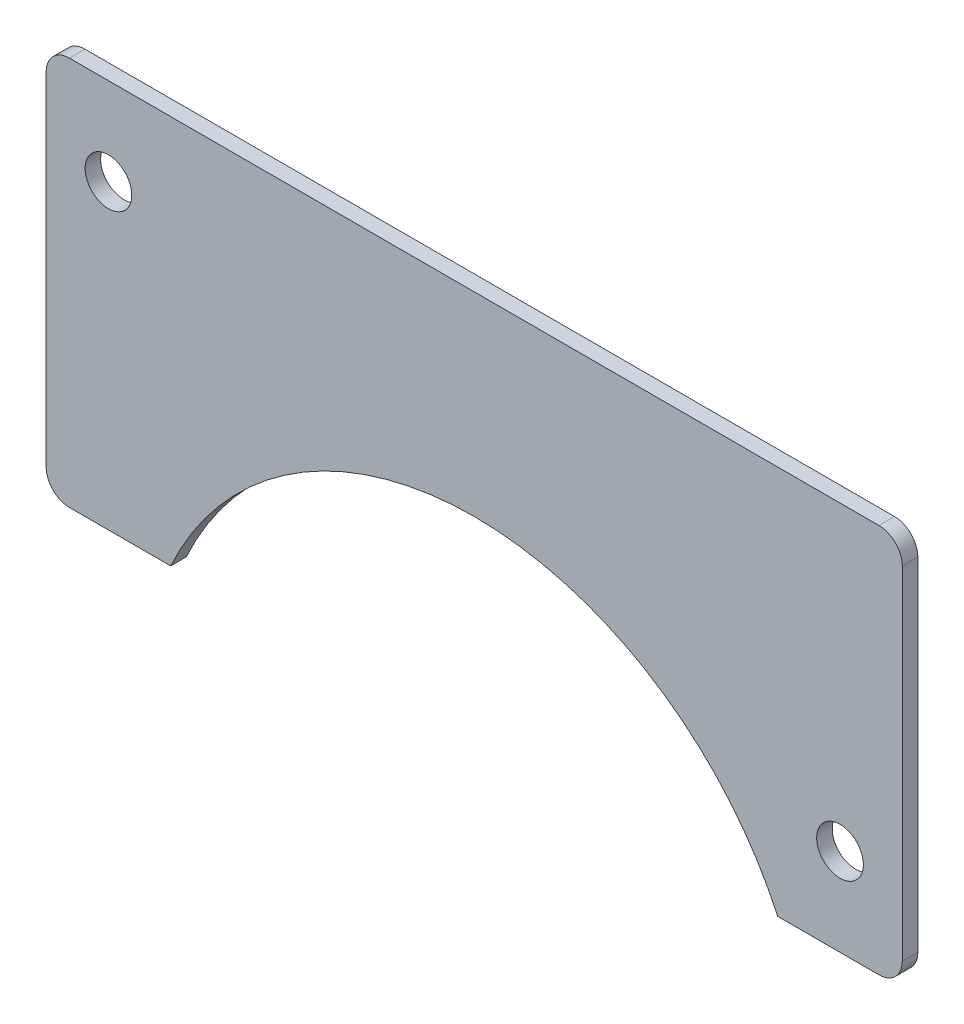
ISO-10303-21;
HEADER;
FILE_DESCRIPTION(('STEP AP214'),'2;1');
FILE_NAME('part.step','',(''),(''),'','','');
FILE_SCHEMA(('AUTOMOTIVE_DESIGN { 1 0 10303 214 1 1 1 1 }'));
ENDSEC;
DATA;
#1=APPLICATION_CONTEXT('core data for automotive mechanical design processes');
#2=APPLICATION_PROTOCOL_DEFINITION('international standard','automotive_design',2000,#1);
#3=PRODUCT_CONTEXT('',#1,'mechanical');
#4=PRODUCT('Part','Part','',(#3));
#5=PRODUCT_RELATED_PRODUCT_CATEGORY('part','',(#4));
#6=PRODUCT_DEFINITION_FORMATION('','',#4);
#7=PRODUCT_DEFINITION_CONTEXT('part definition',#1,'design');
#8=PRODUCT_DEFINITION('design','',#6,#7);
#9=PRODUCT_DEFINITION_SHAPE('','',#8);
#10=(LENGTH_UNIT() NAMED_UNIT(*) SI_UNIT(.MILLI.,.METRE.));
#11=(NAMED_UNIT(*) PLANE_ANGLE_UNIT() SI_UNIT($,.RADIAN.));
#12=(NAMED_UNIT(*) SI_UNIT($,.STERADIAN.) SOLID_ANGLE_UNIT());
#13=UNCERTAINTY_MEASURE_WITH_UNIT(LENGTH_MEASURE(1.E-05),#10,'distance_accuracy_value','');
#14=(GEOMETRIC_REPRESENTATION_CONTEXT(3) GLOBAL_UNCERTAINTY_ASSIGNED_CONTEXT((#13)) GLOBAL_UNIT_ASSIGNED_CONTEXT((#10,
#11,#12)) REPRESENTATION_CONTEXT('',''));
#15=CARTESIAN_POINT('',(0.,0.,0.));
#16=DIRECTION('',(0.,0.,1.));
#17=DIRECTION('',(1.,0.,0.));
#18=AXIS2_PLACEMENT_3D('',#15,#16,#17);
#19=CARTESIAN_POINT('',(-30.0000000000002,0.,20.));
#20=DIRECTION('',(0.,1.,0.));
#21=DIRECTION('',(-1.,0.,0.));
#22=AXIS2_PLACEMENT_3D('',#19,#20,#21);
#23=PLANE('',#22);
#24=DIRECTION('',(1.,0.,0.));
#25=VECTOR('',#24,1.);
#26=CARTESIAN_POINT('',(-30.0000000000002,0.,20.));
#27=LINE('',#26,#25);
#28=CARTESIAN_POINT('',(-160.,0.,20.));
#29=VERTEX_POINT('',#28);
#30=CARTESIAN_POINT('',(-30.0000000000002,0.,20.));
#31=VERTEX_POINT('',#30);
#32=EDGE_CURVE('E199',#29,#31,#27,.T.);
#33=ORIENTED_EDGE('',*,*,#32,.F.);
#34=DIRECTION('',(0.,0.,-1.));
#35=VECTOR('',#34,1.);
#36=CARTESIAN_POINT('',(-160.,0.,20.));
#37=LINE('',#36,#35);
#38=CARTESIAN_POINT('',(-160.,0.,0.));
#39=VERTEX_POINT('',#38);
#40=EDGE_CURVE('E194',#29,#39,#37,.T.);
#41=ORIENTED_EDGE('',*,*,#40,.T.);
#42=DIRECTION('',(1.,0.,0.));
#43=VECTOR('',#42,1.);
#44=CARTESIAN_POINT('',(-30.0000000000002,0.,0.));
#45=LINE('',#44,#43);
#46=CARTESIAN_POINT('',(-30.0000000000002,0.,0.));
#47=VERTEX_POINT('',#46);
#48=EDGE_CURVE('E150',#39,#47,#45,.T.);
#49=ORIENTED_EDGE('',*,*,#48,.T.);
#50=DIRECTION('',(0.,0.,-1.));
#51=VECTOR('',#50,1.);
#52=CARTESIAN_POINT('',(-30.0000000000002,0.,20.));
#53=LINE('',#52,#51);
#54=EDGE_CURVE('E164',#31,#47,#53,.T.);
#55=ORIENTED_EDGE('',*,*,#54,.F.);
#56=EDGE_LOOP('',(#33,#41,#49,#55));
#57=FACE_BOUND('',#56,.T.);
#58=ADVANCED_FACE('F32',(#57),#23,.F.);
#59=CARTESIAN_POINT('',(-1070.,470.,20.));
#60=DIRECTION('',(0.,0.,1.));
#61=DIRECTION('',(1.,0.,0.));
#62=AXIS2_PLACEMENT_3D('',#59,#60,#61);
#63=PLANE('',#62);
#64=CARTESIAN_POINT('',(-550.,-179.2,20.));
#65=DIRECTION('',(0.,0.,-1.));
#66=DIRECTION('',(1.,0.,0.));
#67=AXIS2_PLACEMENT_3D('',#64,#65,#66);
#68=CIRCLE('',#67,429.2);
#69=CARTESIAN_POINT('',(-940.,-1.15116799119851E-13,20.));
#70=VERTEX_POINT('',#69);
#71=EDGE_CURVE('E47',#70,#29,#68,.T.);
#72=ORIENTED_EDGE('',*,*,#71,.T.);
#73=ORIENTED_EDGE('',*,*,#32,.T.);
#74=CARTESIAN_POINT('',(-30.,30.,20.));
#75=DIRECTION('',(0.,0.,1.));
#76=DIRECTION('',(1.,0.,0.));
#77=AXIS2_PLACEMENT_3D('',#74,#75,#76);
#78=CIRCLE('',#77,30.);
#79=CARTESIAN_POINT('',(0.,30.0000000000002,20.));
#80=VERTEX_POINT('',#79);
#81=EDGE_CURVE('E121',#31,#80,#78,.T.);
#82=ORIENTED_EDGE('',*,*,#81,.T.);
#83=DIRECTION('',(0.,1.,0.));
#84=VECTOR('',#83,1.);
#85=CARTESIAN_POINT('',(0.,30.0000000000002,20.));
#86=LINE('',#85,#84);
#87=CARTESIAN_POINT('',(0.,470.,20.));
#88=VERTEX_POINT('',#87);
#89=EDGE_CURVE('E113',#80,#88,#86,.T.);
#90=ORIENTED_EDGE('',*,*,#89,.T.);
#91=CARTESIAN_POINT('',(-30.,470.,20.));
#92=DIRECTION('',(0.,0.,1.));
#93=DIRECTION('',(1.,0.,0.));
#94=AXIS2_PLACEMENT_3D('',#91,#92,#93);
#95=CIRCLE('',#94,30.);
#96=CARTESIAN_POINT('',(-30.0000000000002,500.,20.));
#97=VERTEX_POINT('',#96);
#98=EDGE_CURVE('E118',#88,#97,#95,.T.);
#99=ORIENTED_EDGE('',*,*,#98,.T.);
#100=DIRECTION('',(-1.,0.,0.));
#101=VECTOR('',#100,1.);
#102=CARTESIAN_POINT('',(-30.0000000000002,500.,20.));
#103=LINE('',#102,#101);
#104=CARTESIAN_POINT('',(-1070.,500.,20.));
#105=VERTEX_POINT('',#104);
#106=EDGE_CURVE('E56',#97,#105,#103,.T.);
#107=ORIENTED_EDGE('',*,*,#106,.T.);
#108=CARTESIAN_POINT('',(-1070.,470.,20.));
#109=DIRECTION('',(0.,0.,1.));
#110=DIRECTION('',(1.,0.,0.));
#111=AXIS2_PLACEMENT_3D('',#108,#109,#110);
#112=CIRCLE('',#111,30.);
#113=CARTESIAN_POINT('',(-1100.,470.,20.));
#114=VERTEX_POINT('',#113);
#115=EDGE_CURVE('E160',#105,#114,#112,.T.);
#116=ORIENTED_EDGE('',*,*,#115,.T.);
#117=DIRECTION('',(0.,-1.,0.));
#118=VECTOR('',#117,1.);
#119=CARTESIAN_POINT('',(-1100.,30.0000000000001,20.));
#120=LINE('',#119,#118);
#121=CARTESIAN_POINT('',(-1100.,29.9999999999999,20.));
#122=VERTEX_POINT('',#121);
#123=EDGE_CURVE('E97',#114,#122,#120,.T.);
#124=ORIENTED_EDGE('',*,*,#123,.T.);
#125=CARTESIAN_POINT('',(-1070.,29.9999999999999,20.));
#126=DIRECTION('',(0.,0.,1.));
#127=DIRECTION('',(-1.,0.,0.));
#128=AXIS2_PLACEMENT_3D('',#125,#126,#127);
#129=CIRCLE('',#128,30.);
#130=CARTESIAN_POINT('',(-1070.,-1.31037207508767E-13,20.));
#131=VERTEX_POINT('',#130);
#132=EDGE_CURVE('E175',#122,#131,#129,.T.);
#133=ORIENTED_EDGE('',*,*,#132,.T.);
#134=EDGE_CURVE('E204',#131,#70,#27,.T.);
#135=ORIENTED_EDGE('',*,*,#134,.T.);
#136=EDGE_LOOP('',(#72,#73,#82,#90,#99,#107,#116,#124,#133,#135));
#137=FACE_BOUND('',#136,.T.);
#138=CARTESIAN_POINT('',(-1020.,387.5,20.));
#139=DIRECTION('',(0.,0.,1.));
#140=DIRECTION('',(1.,0.,0.));
#141=AXIS2_PLACEMENT_3D('',#138,#139,#140);
#142=CIRCLE('',#141,30.0000000000001);
#143=CARTESIAN_POINT('',(-990.,387.5,20.));
#144=VERTEX_POINT('',#143);
#145=EDGE_CURVE('E146',#144,#144,#142,.T.);
#146=ORIENTED_EDGE('',*,*,#145,.F.);
#147=EDGE_LOOP('',(#146));
#148=FACE_BOUND('',#147,.T.);
#149=CARTESIAN_POINT('',(-80.,112.5,20.));
#150=DIRECTION('',(0.,0.,1.));
#151=DIRECTION('',(1.,0.,0.));
#152=AXIS2_PLACEMENT_3D('',#149,#150,#151);
#153=CIRCLE('',#152,30.);
#154=CARTESIAN_POINT('',(-50.,112.5,20.));
#155=VERTEX_POINT('',#154);
#156=EDGE_CURVE('E213',#155,#155,#153,.T.);
#157=ORIENTED_EDGE('',*,*,#156,.F.);
#158=EDGE_LOOP('',(#157));
#159=FACE_BOUND('',#158,.T.);
#160=ADVANCED_FACE('F115',(#137,#148,#159),#63,.T.);
#161=CARTESIAN_POINT('',(-1070.,470.,0.));
#162=DIRECTION('',(0.,0.,1.));
#163=DIRECTION('',(1.,0.,0.));
#164=AXIS2_PLACEMENT_3D('',#161,#162,#163);
#165=PLANE('',#164);
#166=ORIENTED_EDGE('',*,*,#48,.F.);
#167=CARTESIAN_POINT('',(-550.,-179.2,0.));
#168=DIRECTION('',(0.,0.,-1.));
#169=DIRECTION('',(1.,0.,0.));
#170=AXIS2_PLACEMENT_3D('',#167,#168,#169);
#171=CIRCLE('',#170,429.2);
#172=CARTESIAN_POINT('',(-940.,0.,0.));
#173=VERTEX_POINT('',#172);
#174=EDGE_CURVE('E184',#173,#39,#171,.T.);
#175=ORIENTED_EDGE('',*,*,#174,.F.);
#176=CARTESIAN_POINT('',(-1070.,-1.31037207508767E-13,0.));
#177=VERTEX_POINT('',#176);
#178=EDGE_CURVE('E151',#177,#173,#45,.T.);
#179=ORIENTED_EDGE('',*,*,#178,.F.);
#180=CARTESIAN_POINT('',(-1070.,29.9999999999999,0.));
#181=DIRECTION('',(0.,0.,1.));
#182=DIRECTION('',(-1.,0.,0.));
#183=AXIS2_PLACEMENT_3D('',#180,#181,#182);
#184=CIRCLE('',#183,30.);
#185=CARTESIAN_POINT('',(-1100.,29.9999999999999,0.));
#186=VERTEX_POINT('',#185);
#187=EDGE_CURVE('E148',#186,#177,#184,.T.);
#188=ORIENTED_EDGE('',*,*,#187,.F.);
#189=DIRECTION('',(0.,-1.,0.));
#190=VECTOR('',#189,1.);
#191=CARTESIAN_POINT('',(-1100.,30.0000000000001,0.));
#192=LINE('',#191,#190);
#193=CARTESIAN_POINT('',(-1100.,470.,0.));
#194=VERTEX_POINT('',#193);
#195=EDGE_CURVE('E145',#194,#186,#192,.T.);
#196=ORIENTED_EDGE('',*,*,#195,.F.);
#197=CARTESIAN_POINT('',(-1070.,470.,0.));
#198=DIRECTION('',(0.,0.,1.));
#199=DIRECTION('',(1.,0.,0.));
#200=AXIS2_PLACEMENT_3D('',#197,#198,#199);
#201=CIRCLE('',#200,30.);
#202=CARTESIAN_POINT('',(-1070.,500.,0.));
#203=VERTEX_POINT('',#202);
#204=EDGE_CURVE('E142',#203,#194,#201,.T.);
#205=ORIENTED_EDGE('',*,*,#204,.F.);
#206=DIRECTION('',(-1.,0.,0.));
#207=VECTOR('',#206,1.);
#208=CARTESIAN_POINT('',(-30.0000000000002,500.,0.));
#209=LINE('',#208,#207);
#210=CARTESIAN_POINT('',(-30.0000000000002,500.,0.));
#211=VERTEX_POINT('',#210);
#212=EDGE_CURVE('E89',#211,#203,#209,.T.);
#213=ORIENTED_EDGE('',*,*,#212,.F.);
#214=CARTESIAN_POINT('',(-30.,470.,0.));
#215=DIRECTION('',(0.,0.,1.));
#216=DIRECTION('',(1.,0.,0.));
#217=AXIS2_PLACEMENT_3D('',#214,#215,#216);
#218=CIRCLE('',#217,30.);
#219=CARTESIAN_POINT('',(0.,470.,0.));
#220=VERTEX_POINT('',#219);
#221=EDGE_CURVE('E157',#220,#211,#218,.T.);
#222=ORIENTED_EDGE('',*,*,#221,.F.);
#223=DIRECTION('',(0.,1.,0.));
#224=VECTOR('',#223,1.);
#225=CARTESIAN_POINT('',(0.,30.0000000000002,0.));
#226=LINE('',#225,#224);
#227=CARTESIAN_POINT('',(0.,30.0000000000002,0.));
#228=VERTEX_POINT('',#227);
#229=EDGE_CURVE('E130',#228,#220,#226,.T.);
#230=ORIENTED_EDGE('',*,*,#229,.F.);
#231=CARTESIAN_POINT('',(-30.,30.,0.));
#232=DIRECTION('',(0.,0.,1.));
#233=DIRECTION('',(1.,0.,0.));
#234=AXIS2_PLACEMENT_3D('',#231,#232,#233);
#235=CIRCLE('',#234,30.);
#236=EDGE_CURVE('E154',#47,#228,#235,.T.);
#237=ORIENTED_EDGE('',*,*,#236,.F.);
#238=EDGE_LOOP('',(#166,#175,#179,#188,#196,#205,#213,#222,#230,#237));
#239=FACE_BOUND('',#238,.T.);
#240=CARTESIAN_POINT('',(-1020.,387.5,0.));
#241=DIRECTION('',(0.,0.,1.));
#242=DIRECTION('',(1.,0.,0.));
#243=AXIS2_PLACEMENT_3D('',#240,#241,#242);
#244=CIRCLE('',#243,30.0000000000001);
#245=CARTESIAN_POINT('',(-990.,387.5,0.));
#246=VERTEX_POINT('',#245);
#247=EDGE_CURVE('E210',#246,#246,#244,.T.);
#248=ORIENTED_EDGE('',*,*,#247,.T.);
#249=EDGE_LOOP('',(#248));
#250=FACE_BOUND('',#249,.T.);
#251=CARTESIAN_POINT('',(-80.,112.5,0.));
#252=DIRECTION('',(0.,0.,1.));
#253=DIRECTION('',(1.,0.,0.));
#254=AXIS2_PLACEMENT_3D('',#251,#252,#253);
#255=CIRCLE('',#254,30.);
#256=CARTESIAN_POINT('',(-50.,112.5,0.));
#257=VERTEX_POINT('',#256);
#258=EDGE_CURVE('E216',#257,#257,#255,.T.);
#259=ORIENTED_EDGE('',*,*,#258,.T.);
#260=EDGE_LOOP('',(#259));
#261=FACE_BOUND('',#260,.T.);
#262=ADVANCED_FACE('F179',(#239,#250,#261),#165,.F.);
#263=CARTESIAN_POINT('',(-1070.,470.,20.));
#264=DIRECTION('',(0.,0.,-1.));
#265=DIRECTION('',(-1.,0.,0.));
#266=AXIS2_PLACEMENT_3D('',#263,#264,#265);
#267=CYLINDRICAL_SURFACE('',#266,30.);
#268=ORIENTED_EDGE('',*,*,#204,.T.);
#269=DIRECTION('',(0.,0.,-1.));
#270=VECTOR('',#269,1.);
#271=CARTESIAN_POINT('',(-1100.,470.,20.));
#272=LINE('',#271,#270);
#273=EDGE_CURVE('E11',#114,#194,#272,.T.);
#274=ORIENTED_EDGE('',*,*,#273,.F.);
#275=ORIENTED_EDGE('',*,*,#115,.F.);
#276=DIRECTION('',(0.,0.,-1.));
#277=VECTOR('',#276,1.);
#278=CARTESIAN_POINT('',(-1070.,500.,20.));
#279=LINE('',#278,#277);
#280=EDGE_CURVE('E138',#105,#203,#279,.T.);
#281=ORIENTED_EDGE('',*,*,#280,.T.);
#282=EDGE_LOOP('',(#268,#274,#275,#281));
#283=FACE_BOUND('',#282,.T.);
#284=ADVANCED_FACE('F34',(#283),#267,.T.);
#285=CARTESIAN_POINT('',(-1100.,30.0000000000001,20.));
#286=DIRECTION('',(1.,0.,0.));
#287=DIRECTION('',(0.,0.,-1.));
#288=AXIS2_PLACEMENT_3D('',#285,#286,#287);
#289=PLANE('',#288);
#290=ORIENTED_EDGE('',*,*,#195,.T.);
#291=DIRECTION('',(0.,0.,-1.));
#292=VECTOR('',#291,1.);
#293=CARTESIAN_POINT('',(-1100.,29.9999999999999,20.));
#294=LINE('',#293,#292);
#295=EDGE_CURVE('E40',#122,#186,#294,.T.);
#296=ORIENTED_EDGE('',*,*,#295,.F.);
#297=ORIENTED_EDGE('',*,*,#123,.F.);
#298=ORIENTED_EDGE('',*,*,#273,.T.);
#299=EDGE_LOOP('',(#290,#296,#297,#298));
#300=FACE_BOUND('',#299,.T.);
#301=ADVANCED_FACE('F225',(#300),#289,.F.);
#302=CARTESIAN_POINT('',(-1070.,29.9999999999999,20.));
#303=DIRECTION('',(0.,0.,-1.));
#304=DIRECTION('',(-1.,0.,0.));
#305=AXIS2_PLACEMENT_3D('',#302,#303,#304);
#306=CYLINDRICAL_SURFACE('',#305,30.);
#307=ORIENTED_EDGE('',*,*,#187,.T.);
#308=DIRECTION('',(0.,0.,-1.));
#309=VECTOR('',#308,1.);
#310=CARTESIAN_POINT('',(-1070.,-1.31037207508767E-13,20.));
#311=LINE('',#310,#309);
#312=EDGE_CURVE('E167',#131,#177,#311,.T.);
#313=ORIENTED_EDGE('',*,*,#312,.F.);
#314=ORIENTED_EDGE('',*,*,#132,.F.);
#315=ORIENTED_EDGE('',*,*,#295,.T.);
#316=EDGE_LOOP('',(#307,#313,#314,#315));
#317=FACE_BOUND('',#316,.T.);
#318=ADVANCED_FACE('F173',(#317),#306,.T.);
#319=ORIENTED_EDGE('',*,*,#178,.T.);
#320=DIRECTION('',(0.,0.,-1.));
#321=VECTOR('',#320,1.);
#322=CARTESIAN_POINT('',(-940.,0.,20.));
#323=LINE('',#322,#321);
#324=EDGE_CURVE('E188',#70,#173,#323,.T.);
#325=ORIENTED_EDGE('',*,*,#324,.F.);
#326=ORIENTED_EDGE('',*,*,#134,.F.);
#327=ORIENTED_EDGE('',*,*,#312,.T.);
#328=EDGE_LOOP('',(#319,#325,#326,#327));
#329=FACE_BOUND('',#328,.T.);
#330=ADVANCED_FACE('F186',(#329),#23,.F.);
#331=CARTESIAN_POINT('',(-30.,30.,20.));
#332=DIRECTION('',(0.,0.,-1.));
#333=DIRECTION('',(-1.,0.,0.));
#334=AXIS2_PLACEMENT_3D('',#331,#332,#333);
#335=CYLINDRICAL_SURFACE('',#334,30.);
#336=ORIENTED_EDGE('',*,*,#236,.T.);
#337=DIRECTION('',(0.,0.,-1.));
#338=VECTOR('',#337,1.);
#339=CARTESIAN_POINT('',(0.,30.0000000000002,20.));
#340=LINE('',#339,#338);
#341=EDGE_CURVE('E133',#80,#228,#340,.T.);
#342=ORIENTED_EDGE('',*,*,#341,.F.);
#343=ORIENTED_EDGE('',*,*,#81,.F.);
#344=ORIENTED_EDGE('',*,*,#54,.T.);
#345=EDGE_LOOP('',(#336,#342,#343,#344));
#346=FACE_BOUND('',#345,.T.);
#347=ADVANCED_FACE('F203',(#346),#335,.T.);
#348=CARTESIAN_POINT('',(0.,30.0000000000002,20.));
#349=DIRECTION('',(-1.,0.,0.));
#350=DIRECTION('',(0.,-1.,0.));
#351=AXIS2_PLACEMENT_3D('',#348,#349,#350);
#352=PLANE('',#351);
#353=ORIENTED_EDGE('',*,*,#229,.T.);
#354=DIRECTION('',(0.,0.,-1.));
#355=VECTOR('',#354,1.);
#356=CARTESIAN_POINT('',(0.,470.,20.));
#357=LINE('',#356,#355);
#358=EDGE_CURVE('E127',#88,#220,#357,.T.);
#359=ORIENTED_EDGE('',*,*,#358,.F.);
#360=ORIENTED_EDGE('',*,*,#89,.F.);
#361=ORIENTED_EDGE('',*,*,#341,.T.);
#362=EDGE_LOOP('',(#353,#359,#360,#361));
#363=FACE_BOUND('',#362,.T.);
#364=ADVANCED_FACE('F128',(#363),#352,.F.);
#365=CARTESIAN_POINT('',(-30.,470.,20.));
#366=DIRECTION('',(0.,0.,-1.));
#367=DIRECTION('',(-1.,0.,0.));
#368=AXIS2_PLACEMENT_3D('',#365,#366,#367);
#369=CYLINDRICAL_SURFACE('',#368,30.);
#370=ORIENTED_EDGE('',*,*,#221,.T.);
#371=DIRECTION('',(0.,0.,-1.));
#372=VECTOR('',#371,1.);
#373=CARTESIAN_POINT('',(-30.0000000000002,500.,20.));
#374=LINE('',#373,#372);
#375=EDGE_CURVE('E134',#97,#211,#374,.T.);
#376=ORIENTED_EDGE('',*,*,#375,.F.);
#377=ORIENTED_EDGE('',*,*,#98,.F.);
#378=ORIENTED_EDGE('',*,*,#358,.T.);
#379=EDGE_LOOP('',(#370,#376,#377,#378));
#380=FACE_BOUND('',#379,.T.);
#381=ADVANCED_FACE('F136',(#380),#369,.T.);
#382=CARTESIAN_POINT('',(-30.0000000000002,500.,20.));
#383=DIRECTION('',(0.,-1.,0.));
#384=DIRECTION('',(1.,0.,0.));
#385=AXIS2_PLACEMENT_3D('',#382,#383,#384);
#386=PLANE('',#385);
#387=ORIENTED_EDGE('',*,*,#212,.T.);
#388=ORIENTED_EDGE('',*,*,#280,.F.);
#389=ORIENTED_EDGE('',*,*,#106,.F.);
#390=ORIENTED_EDGE('',*,*,#375,.T.);
#391=EDGE_LOOP('',(#387,#388,#389,#390));
#392=FACE_BOUND('',#391,.T.);
#393=ADVANCED_FACE('F250',(#392),#386,.F.);
#394=CARTESIAN_POINT('',(-1020.,387.5,20.));
#395=DIRECTION('',(0.,0.,-1.));
#396=DIRECTION('',(-1.,0.,0.));
#397=AXIS2_PLACEMENT_3D('',#394,#395,#396);
#398=CYLINDRICAL_SURFACE('',#397,30.0000000000001);
#399=ORIENTED_EDGE('',*,*,#145,.T.);
#400=EDGE_LOOP('',(#399));
#401=FACE_BOUND('',#400,.T.);
#402=ORIENTED_EDGE('',*,*,#247,.F.);
#403=EDGE_LOOP('',(#402));
#404=FACE_BOUND('',#403,.T.);
#405=ADVANCED_FACE('F253',(#401,#404),#398,.F.);
#406=CARTESIAN_POINT('',(-80.,112.5,20.));
#407=DIRECTION('',(0.,0.,-1.));
#408=DIRECTION('',(-1.,0.,0.));
#409=AXIS2_PLACEMENT_3D('',#406,#407,#408);
#410=CYLINDRICAL_SURFACE('',#409,30.);
#411=ORIENTED_EDGE('',*,*,#156,.T.);
#412=EDGE_LOOP('',(#411));
#413=FACE_BOUND('',#412,.T.);
#414=ORIENTED_EDGE('',*,*,#258,.F.);
#415=EDGE_LOOP('',(#414));
#416=FACE_BOUND('',#415,.T.);
#417=ADVANCED_FACE('F258',(#413,#416),#410,.F.);
#418=CARTESIAN_POINT('',(-550.,-179.2,20.));
#419=DIRECTION('',(0.,0.,-1.));
#420=DIRECTION('',(-1.,0.,0.));
#421=AXIS2_PLACEMENT_3D('',#418,#419,#420);
#422=CYLINDRICAL_SURFACE('',#421,429.2);
#423=ORIENTED_EDGE('',*,*,#174,.T.);
#424=ORIENTED_EDGE('',*,*,#40,.F.);
#425=ORIENTED_EDGE('',*,*,#71,.F.);
#426=ORIENTED_EDGE('',*,*,#324,.T.);
#427=EDGE_LOOP('',(#423,#424,#425,#426));
#428=FACE_BOUND('',#427,.T.);
#429=ADVANCED_FACE('F193',(#428),#422,.F.);
#430=CLOSED_SHELL('',(#58,#160,#262,#284,#301,#318,#330,#347,#364,#381,#393,#405,#417,#429));
#431=MANIFOLD_SOLID_BREP('B2',#430);
#432=ADVANCED_BREP_SHAPE_REPRESENTATION('',(#18,#431),#14);
#433=SHAPE_DEFINITION_REPRESENTATION(#9,#432);
ENDSEC;
END-ISO-10303-21;
